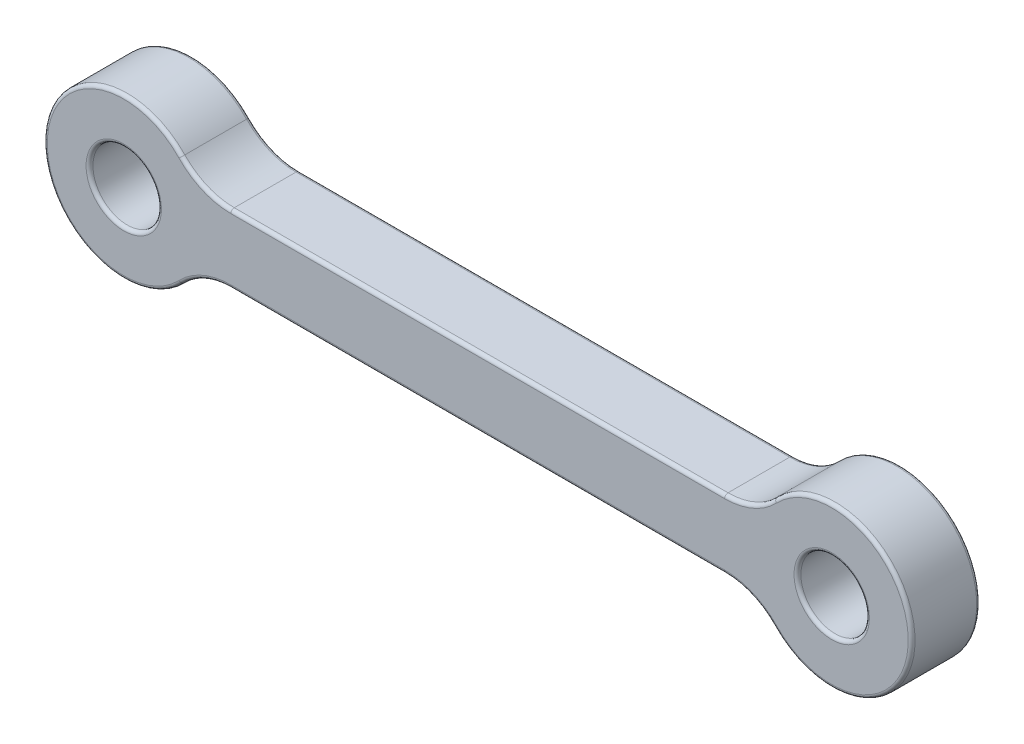
ISO-10303-21;
HEADER;
FILE_DESCRIPTION(('STEP AP214'),'2;1');
FILE_NAME('part.step','',(''),(''),'','','');
FILE_SCHEMA(('AUTOMOTIVE_DESIGN { 1 0 10303 214 1 1 1 1 }'));
ENDSEC;
DATA;
#1=APPLICATION_CONTEXT('core data for automotive mechanical design processes');
#2=APPLICATION_PROTOCOL_DEFINITION('international standard','automotive_design',2000,#1);
#3=PRODUCT_CONTEXT('',#1,'mechanical');
#4=PRODUCT('Part','Part','',(#3));
#5=PRODUCT_RELATED_PRODUCT_CATEGORY('part','',(#4));
#6=PRODUCT_DEFINITION_FORMATION('','',#4);
#7=PRODUCT_DEFINITION_CONTEXT('part definition',#1,'design');
#8=PRODUCT_DEFINITION('design','',#6,#7);
#9=PRODUCT_DEFINITION_SHAPE('','',#8);
#10=(LENGTH_UNIT() NAMED_UNIT(*) SI_UNIT(.MILLI.,.METRE.));
#11=(NAMED_UNIT(*) PLANE_ANGLE_UNIT() SI_UNIT($,.RADIAN.));
#12=(NAMED_UNIT(*) SI_UNIT($,.STERADIAN.) SOLID_ANGLE_UNIT());
#13=UNCERTAINTY_MEASURE_WITH_UNIT(LENGTH_MEASURE(1.E-05),#10,'distance_accuracy_value','');
#14=(GEOMETRIC_REPRESENTATION_CONTEXT(3) GLOBAL_UNCERTAINTY_ASSIGNED_CONTEXT((#13)) GLOBAL_UNIT_ASSIGNED_CONTEXT((#10,
#11,#12)) REPRESENTATION_CONTEXT('',''));
#15=CARTESIAN_POINT('',(0.,0.,0.));
#16=DIRECTION('',(0.,0.,1.));
#17=DIRECTION('',(1.,0.,0.));
#18=AXIS2_PLACEMENT_3D('',#15,#16,#17);
#19=CARTESIAN_POINT('',(0.,1.5,1.5));
#20=DIRECTION('',(0.,-1.,0.));
#21=DIRECTION('',(0.,0.,-1.));
#22=AXIS2_PLACEMENT_3D('',#19,#20,#21);
#23=PLANE('',#22);
#24=DIRECTION('',(0.,0.,-1.));
#25=VECTOR('',#24,1.);
#26=CARTESIAN_POINT('',(26.3095842401766,1.5,1.5));
#27=LINE('',#26,#25);
#28=CARTESIAN_POINT('',(26.3095842401766,1.5,1.35));
#29=VERTEX_POINT('',#28);
#30=CARTESIAN_POINT('',(26.3095842401766,1.5,-1.35));
#31=VERTEX_POINT('',#30);
#32=EDGE_CURVE('E303',#29,#31,#27,.T.);
#33=ORIENTED_EDGE('',*,*,#32,.T.);
#34=DIRECTION('',(-1.,0.,0.));
#35=VECTOR('',#34,1.);
#36=CARTESIAN_POINT('',(0.,1.5,-1.35));
#37=LINE('',#36,#35);
#38=CARTESIAN_POINT('',(4.69041575982343,1.5,-1.35));
#39=VERTEX_POINT('',#38);
#40=EDGE_CURVE('E225',#31,#39,#37,.T.);
#41=ORIENTED_EDGE('',*,*,#40,.T.);
#42=DIRECTION('',(0.,0.,1.));
#43=VECTOR('',#42,1.);
#44=CARTESIAN_POINT('',(4.69041575982343,1.5,1.5));
#45=LINE('',#44,#43);
#46=CARTESIAN_POINT('',(4.69041575982343,1.5,1.35));
#47=VERTEX_POINT('',#46);
#48=EDGE_CURVE('E297',#39,#47,#45,.T.);
#49=ORIENTED_EDGE('',*,*,#48,.T.);
#50=DIRECTION('',(-1.,0.,0.));
#51=VECTOR('',#50,1.);
#52=CARTESIAN_POINT('',(26.3095842401766,1.5,1.35));
#53=LINE('',#52,#51);
#54=EDGE_CURVE('E223',#47,#29,#53,.F.);
#55=ORIENTED_EDGE('',*,*,#54,.T.);
#56=EDGE_LOOP('',(#33,#41,#49,#55));
#57=FACE_BOUND('',#56,.T.);
#58=ADVANCED_FACE('F37',(#57),#23,.F.);
#59=CARTESIAN_POINT('',(0.,0.,1.5));
#60=DIRECTION('',(0.,0.,-1.));
#61=DIRECTION('',(-1.,0.,0.));
#62=AXIS2_PLACEMENT_3D('',#59,#60,#61);
#63=CYLINDRICAL_SURFACE('',#62,3.5);
#64=DIRECTION('',(0.,0.,-1.));
#65=VECTOR('',#64,1.);
#66=CARTESIAN_POINT('',(2.52560848605877,2.42307692307692,1.5));
#67=LINE('',#66,#65);
#68=CARTESIAN_POINT('',(2.52560848605877,2.42307692307692,1.35));
#69=VERTEX_POINT('',#68);
#70=CARTESIAN_POINT('',(2.52560848605877,2.42307692307692,-1.35));
#71=VERTEX_POINT('',#70);
#72=EDGE_CURVE('E299',#69,#71,#67,.T.);
#73=ORIENTED_EDGE('',*,*,#72,.T.);
#74=CARTESIAN_POINT('',(0.,0.,-1.35));
#75=DIRECTION('',(0.,0.,1.));
#76=DIRECTION('',(1.,0.,0.));
#77=AXIS2_PLACEMENT_3D('',#74,#75,#76);
#78=CIRCLE('',#77,3.5);
#79=CARTESIAN_POINT('',(2.52560848605877,-2.42307692307692,-1.35));
#80=VERTEX_POINT('',#79);
#81=EDGE_CURVE('E200',#71,#80,#78,.T.);
#82=ORIENTED_EDGE('',*,*,#81,.T.);
#83=DIRECTION('',(0.,0.,-1.));
#84=VECTOR('',#83,1.);
#85=CARTESIAN_POINT('',(2.52560848605877,-2.42307692307692,1.5));
#86=LINE('',#85,#84);
#87=CARTESIAN_POINT('',(2.52560848605877,-2.42307692307692,1.35));
#88=VERTEX_POINT('',#87);
#89=EDGE_CURVE('E304',#80,#88,#86,.F.);
#90=ORIENTED_EDGE('',*,*,#89,.T.);
#91=CARTESIAN_POINT('',(0.,0.,1.35));
#92=DIRECTION('',(0.,0.,1.));
#93=DIRECTION('',(1.,0.,0.));
#94=AXIS2_PLACEMENT_3D('',#91,#92,#93);
#95=CIRCLE('',#94,3.5);
#96=EDGE_CURVE('E198',#88,#69,#95,.F.);
#97=ORIENTED_EDGE('',*,*,#96,.T.);
#98=EDGE_LOOP('',(#73,#82,#90,#97));
#99=FACE_BOUND('',#98,.T.);
#100=ADVANCED_FACE('F334',(#99),#63,.T.);
#101=CARTESIAN_POINT('',(0.,-1.5,1.5));
#102=DIRECTION('',(0.,-1.,0.));
#103=DIRECTION('',(0.,0.,-1.));
#104=AXIS2_PLACEMENT_3D('',#101,#102,#103);
#105=PLANE('',#104);
#106=DIRECTION('',(0.,0.,-1.));
#107=VECTOR('',#106,1.);
#108=CARTESIAN_POINT('',(4.69041575982343,-1.5,1.5));
#109=LINE('',#108,#107);
#110=CARTESIAN_POINT('',(4.69041575982343,-1.5,1.35));
#111=VERTEX_POINT('',#110);
#112=CARTESIAN_POINT('',(4.69041575982343,-1.5,-1.35));
#113=VERTEX_POINT('',#112);
#114=EDGE_CURVE('E337',#111,#113,#109,.T.);
#115=ORIENTED_EDGE('',*,*,#114,.T.);
#116=DIRECTION('',(-1.,0.,0.));
#117=VECTOR('',#116,1.);
#118=CARTESIAN_POINT('',(26.3095842401766,-1.5,-1.35));
#119=LINE('',#118,#117);
#120=CARTESIAN_POINT('',(26.3095842401766,-1.5,-1.35));
#121=VERTEX_POINT('',#120);
#122=EDGE_CURVE('E208',#113,#121,#119,.F.);
#123=ORIENTED_EDGE('',*,*,#122,.T.);
#124=DIRECTION('',(0.,0.,1.));
#125=VECTOR('',#124,1.);
#126=CARTESIAN_POINT('',(26.3095842401766,-1.5,1.5));
#127=LINE('',#126,#125);
#128=CARTESIAN_POINT('',(26.3095842401766,-1.5,1.35));
#129=VERTEX_POINT('',#128);
#130=EDGE_CURVE('E335',#121,#129,#127,.T.);
#131=ORIENTED_EDGE('',*,*,#130,.T.);
#132=DIRECTION('',(-1.,0.,0.));
#133=VECTOR('',#132,1.);
#134=CARTESIAN_POINT('',(0.,-1.5,1.35));
#135=LINE('',#134,#133);
#136=EDGE_CURVE('E206',#129,#111,#135,.T.);
#137=ORIENTED_EDGE('',*,*,#136,.T.);
#138=EDGE_LOOP('',(#115,#123,#131,#137));
#139=FACE_BOUND('',#138,.T.);
#140=ADVANCED_FACE('F373',(#139),#105,.T.);
#141=CARTESIAN_POINT('',(0.,0.,1.5));
#142=DIRECTION('',(0.,0.,-1.));
#143=DIRECTION('',(-1.,0.,0.));
#144=AXIS2_PLACEMENT_3D('',#141,#142,#143);
#145=CYLINDRICAL_SURFACE('',#144,1.5);
#146=CARTESIAN_POINT('',(0.,0.,-1.35));
#147=DIRECTION('',(0.,0.,1.));
#148=DIRECTION('',(1.,0.,0.));
#149=AXIS2_PLACEMENT_3D('',#146,#147,#148);
#150=CIRCLE('',#149,1.5);
#151=CARTESIAN_POINT('',(1.5,0.,-1.35));
#152=VERTEX_POINT('',#151);
#153=EDGE_CURVE('E192',#152,#152,#150,.F.);
#154=ORIENTED_EDGE('',*,*,#153,.T.);
#155=EDGE_LOOP('',(#154));
#156=FACE_BOUND('',#155,.T.);
#157=CARTESIAN_POINT('',(0.,0.,1.35));
#158=DIRECTION('',(0.,0.,1.));
#159=DIRECTION('',(1.,0.,0.));
#160=AXIS2_PLACEMENT_3D('',#157,#158,#159);
#161=CIRCLE('',#160,1.5);
#162=CARTESIAN_POINT('',(1.5,0.,1.35));
#163=VERTEX_POINT('',#162);
#164=EDGE_CURVE('E189',#163,#163,#161,.T.);
#165=ORIENTED_EDGE('',*,*,#164,.T.);
#166=EDGE_LOOP('',(#165));
#167=FACE_BOUND('',#166,.T.);
#168=ADVANCED_FACE('F640',(#156,#167),#145,.F.);
#169=CARTESIAN_POINT('',(31.,0.,1.5));
#170=DIRECTION('',(0.,0.,-1.));
#171=DIRECTION('',(-1.,0.,0.));
#172=AXIS2_PLACEMENT_3D('',#169,#170,#171);
#173=CYLINDRICAL_SURFACE('',#172,3.5);
#174=DIRECTION('',(0.,0.,-1.));
#175=VECTOR('',#174,1.);
#176=CARTESIAN_POINT('',(28.4743915139412,-2.42307692307692,1.5));
#177=LINE('',#176,#175);
#178=CARTESIAN_POINT('',(28.4743915139412,-2.42307692307692,1.35));
#179=VERTEX_POINT('',#178);
#180=CARTESIAN_POINT('',(28.4743915139412,-2.42307692307692,-1.35));
#181=VERTEX_POINT('',#180);
#182=EDGE_CURVE('E342',#179,#181,#177,.T.);
#183=ORIENTED_EDGE('',*,*,#182,.T.);
#184=CARTESIAN_POINT('',(31.,0.,-1.35));
#185=DIRECTION('',(0.,0.,1.));
#186=DIRECTION('',(1.,0.,0.));
#187=AXIS2_PLACEMENT_3D('',#184,#185,#186);
#188=CIRCLE('',#187,3.5);
#189=CARTESIAN_POINT('',(28.4743915139412,2.42307692307692,-1.35));
#190=VERTEX_POINT('',#189);
#191=EDGE_CURVE('E217',#181,#190,#188,.T.);
#192=ORIENTED_EDGE('',*,*,#191,.T.);
#193=DIRECTION('',(0.,0.,-1.));
#194=VECTOR('',#193,1.);
#195=CARTESIAN_POINT('',(28.4743915139412,2.42307692307692,1.5));
#196=LINE('',#195,#194);
#197=CARTESIAN_POINT('',(28.4743915139412,2.42307692307692,1.35));
#198=VERTEX_POINT('',#197);
#199=EDGE_CURVE('E260',#190,#198,#196,.F.);
#200=ORIENTED_EDGE('',*,*,#199,.T.);
#201=CARTESIAN_POINT('',(31.,0.,1.35));
#202=DIRECTION('',(0.,0.,1.));
#203=DIRECTION('',(1.,0.,0.));
#204=AXIS2_PLACEMENT_3D('',#201,#202,#203);
#205=CIRCLE('',#204,3.5);
#206=EDGE_CURVE('E215',#198,#179,#205,.F.);
#207=ORIENTED_EDGE('',*,*,#206,.T.);
#208=EDGE_LOOP('',(#183,#192,#200,#207));
#209=FACE_BOUND('',#208,.T.);
#210=ADVANCED_FACE('F349',(#209),#173,.T.);
#211=CARTESIAN_POINT('',(31.,0.,1.5));
#212=DIRECTION('',(0.,0.,-1.));
#213=DIRECTION('',(-1.,0.,0.));
#214=AXIS2_PLACEMENT_3D('',#211,#212,#213);
#215=CYLINDRICAL_SURFACE('',#214,1.5);
#216=CARTESIAN_POINT('',(31.,0.,-1.35));
#217=DIRECTION('',(0.,0.,1.));
#218=DIRECTION('',(1.,0.,0.));
#219=AXIS2_PLACEMENT_3D('',#216,#217,#218);
#220=CIRCLE('',#219,1.5);
#221=CARTESIAN_POINT('',(32.5,0.,-1.35));
#222=VERTEX_POINT('',#221);
#223=EDGE_CURVE('E172',#222,#222,#220,.F.);
#224=ORIENTED_EDGE('',*,*,#223,.T.);
#225=EDGE_LOOP('',(#224));
#226=FACE_BOUND('',#225,.T.);
#227=CARTESIAN_POINT('',(31.,0.,1.35));
#228=DIRECTION('',(0.,0.,1.));
#229=DIRECTION('',(1.,0.,0.));
#230=AXIS2_PLACEMENT_3D('',#227,#228,#229);
#231=CIRCLE('',#230,1.5);
#232=CARTESIAN_POINT('',(32.5,0.,1.35));
#233=VERTEX_POINT('',#232);
#234=EDGE_CURVE('E306',#233,#233,#231,.T.);
#235=ORIENTED_EDGE('',*,*,#234,.T.);
#236=EDGE_LOOP('',(#235));
#237=FACE_BOUND('',#236,.T.);
#238=ADVANCED_FACE('F618',(#226,#237),#215,.F.);
#239=CARTESIAN_POINT('',(0.,0.,1.5));
#240=DIRECTION('',(0.,0.,1.));
#241=DIRECTION('',(1.,0.,0.));
#242=AXIS2_PLACEMENT_3D('',#239,#240,#241);
#243=PLANE('',#242);
#244=CARTESIAN_POINT('',(31.,0.,1.5));
#245=DIRECTION('',(0.,0.,1.));
#246=DIRECTION('',(1.,0.,0.));
#247=AXIS2_PLACEMENT_3D('',#244,#245,#246);
#248=CIRCLE('',#247,1.65);
#249=CARTESIAN_POINT('',(32.65,0.,1.5));
#250=VERTEX_POINT('',#249);
#251=EDGE_CURVE('E11',#250,#250,#248,.F.);
#252=ORIENTED_EDGE('',*,*,#251,.T.);
#253=EDGE_LOOP('',(#252));
#254=FACE_BOUND('',#253,.T.);
#255=CARTESIAN_POINT('',(0.,0.,1.5));
#256=DIRECTION('',(0.,0.,1.));
#257=DIRECTION('',(1.,0.,0.));
#258=AXIS2_PLACEMENT_3D('',#255,#256,#257);
#259=CIRCLE('',#258,1.65);
#260=CARTESIAN_POINT('',(1.65,0.,1.5));
#261=VERTEX_POINT('',#260);
#262=EDGE_CURVE('E46',#261,#261,#259,.F.);
#263=ORIENTED_EDGE('',*,*,#262,.T.);
#264=EDGE_LOOP('',(#263));
#265=FACE_BOUND('',#264,.T.);
#266=DIRECTION('',(-1.,0.,0.));
#267=VECTOR('',#266,1.);
#268=CARTESIAN_POINT('',(0.,-1.35,1.5));
#269=LINE('',#268,#267);
#270=CARTESIAN_POINT('',(4.69041575982343,-1.35,1.5));
#271=VERTEX_POINT('',#270);
#272=CARTESIAN_POINT('',(26.3095842401766,-1.35,1.5));
#273=VERTEX_POINT('',#272);
#274=EDGE_CURVE('E54',#271,#273,#269,.F.);
#275=ORIENTED_EDGE('',*,*,#274,.T.);
#276=CARTESIAN_POINT('',(26.3095842401766,-4.5,1.5));
#277=DIRECTION('',(0.,0.,1.));
#278=DIRECTION('',(1.,0.,0.));
#279=AXIS2_PLACEMENT_3D('',#276,#277,#278);
#280=CIRCLE('',#279,3.15);
#281=CARTESIAN_POINT('',(28.5826318776295,-2.31923076923077,1.5));
#282=VERTEX_POINT('',#281);
#283=EDGE_CURVE('E239',#273,#282,#280,.F.);
#284=ORIENTED_EDGE('',*,*,#283,.T.);
#285=CARTESIAN_POINT('',(31.,0.,1.5));
#286=DIRECTION('',(0.,0.,1.));
#287=DIRECTION('',(1.,0.,0.));
#288=AXIS2_PLACEMENT_3D('',#285,#286,#287);
#289=CIRCLE('',#288,3.35);
#290=CARTESIAN_POINT('',(28.5826318776295,2.31923076923077,1.5));
#291=VERTEX_POINT('',#290);
#292=EDGE_CURVE('E227',#282,#291,#289,.T.);
#293=ORIENTED_EDGE('',*,*,#292,.T.);
#294=CARTESIAN_POINT('',(26.3095842401766,4.5,1.5));
#295=DIRECTION('',(0.,0.,1.));
#296=DIRECTION('',(1.,0.,0.));
#297=AXIS2_PLACEMENT_3D('',#294,#295,#296);
#298=CIRCLE('',#297,3.15);
#299=CARTESIAN_POINT('',(26.3095842401766,1.35,1.5));
#300=VERTEX_POINT('',#299);
#301=EDGE_CURVE('E229',#291,#300,#298,.F.);
#302=ORIENTED_EDGE('',*,*,#301,.T.);
#303=DIRECTION('',(-1.,0.,0.));
#304=VECTOR('',#303,1.);
#305=CARTESIAN_POINT('',(4.69041575982343,1.35,1.5));
#306=LINE('',#305,#304);
#307=CARTESIAN_POINT('',(4.69041575982343,1.35,1.5));
#308=VERTEX_POINT('',#307);
#309=EDGE_CURVE('E231',#300,#308,#306,.T.);
#310=ORIENTED_EDGE('',*,*,#309,.T.);
#311=CARTESIAN_POINT('',(4.69041575982343,4.5,1.5));
#312=DIRECTION('',(0.,0.,1.));
#313=DIRECTION('',(1.,0.,0.));
#314=AXIS2_PLACEMENT_3D('',#311,#312,#313);
#315=CIRCLE('',#314,3.15);
#316=CARTESIAN_POINT('',(2.41736812237054,2.31923076923077,1.5));
#317=VERTEX_POINT('',#316);
#318=EDGE_CURVE('E233',#308,#317,#315,.F.);
#319=ORIENTED_EDGE('',*,*,#318,.T.);
#320=CARTESIAN_POINT('',(0.,0.,1.5));
#321=DIRECTION('',(0.,0.,1.));
#322=DIRECTION('',(1.,0.,0.));
#323=AXIS2_PLACEMENT_3D('',#320,#321,#322);
#324=CIRCLE('',#323,3.35);
#325=CARTESIAN_POINT('',(2.41736812237054,-2.31923076923077,1.5));
#326=VERTEX_POINT('',#325);
#327=EDGE_CURVE('E235',#317,#326,#324,.T.);
#328=ORIENTED_EDGE('',*,*,#327,.T.);
#329=CARTESIAN_POINT('',(4.69041575982343,-4.5,1.5));
#330=DIRECTION('',(0.,0.,1.));
#331=DIRECTION('',(1.,0.,0.));
#332=AXIS2_PLACEMENT_3D('',#329,#330,#331);
#333=CIRCLE('',#332,3.15);
#334=EDGE_CURVE('E59',#326,#271,#333,.F.);
#335=ORIENTED_EDGE('',*,*,#334,.T.);
#336=EDGE_LOOP('',(#275,#284,#293,#302,#310,#319,#328,#335));
#337=FACE_BOUND('',#336,.T.);
#338=ADVANCED_FACE('F392',(#254,#265,#337),#243,.T.);
#339=CARTESIAN_POINT('',(0.,0.,-1.5));
#340=DIRECTION('',(0.,0.,1.));
#341=DIRECTION('',(1.,0.,0.));
#342=AXIS2_PLACEMENT_3D('',#339,#340,#341);
#343=PLANE('',#342);
#344=CARTESIAN_POINT('',(31.,0.,-1.5));
#345=DIRECTION('',(0.,0.,1.));
#346=DIRECTION('',(1.,0.,0.));
#347=AXIS2_PLACEMENT_3D('',#344,#345,#346);
#348=CIRCLE('',#347,1.65);
#349=CARTESIAN_POINT('',(32.65,0.,-1.5));
#350=VERTEX_POINT('',#349);
#351=EDGE_CURVE('E181',#350,#350,#348,.T.);
#352=ORIENTED_EDGE('',*,*,#351,.T.);
#353=EDGE_LOOP('',(#352));
#354=FACE_BOUND('',#353,.T.);
#355=CARTESIAN_POINT('',(0.,0.,-1.5));
#356=DIRECTION('',(0.,0.,1.));
#357=DIRECTION('',(1.,0.,0.));
#358=AXIS2_PLACEMENT_3D('',#355,#356,#357);
#359=CIRCLE('',#358,1.65);
#360=CARTESIAN_POINT('',(1.65,0.,-1.5));
#361=VERTEX_POINT('',#360);
#362=EDGE_CURVE('E178',#361,#361,#359,.T.);
#363=ORIENTED_EDGE('',*,*,#362,.T.);
#364=EDGE_LOOP('',(#363));
#365=FACE_BOUND('',#364,.T.);
#366=CARTESIAN_POINT('',(0.,0.,-1.5));
#367=DIRECTION('',(0.,0.,1.));
#368=DIRECTION('',(1.,0.,0.));
#369=AXIS2_PLACEMENT_3D('',#366,#367,#368);
#370=CIRCLE('',#369,3.35);
#371=CARTESIAN_POINT('',(2.41736812237054,-2.31923076923077,-1.5));
#372=VERTEX_POINT('',#371);
#373=CARTESIAN_POINT('',(2.41736812237054,2.31923076923077,-1.5));
#374=VERTEX_POINT('',#373);
#375=EDGE_CURVE('E176',#372,#374,#370,.F.);
#376=ORIENTED_EDGE('',*,*,#375,.T.);
#377=CARTESIAN_POINT('',(4.69041575982343,4.5,-1.5));
#378=DIRECTION('',(0.,0.,1.));
#379=DIRECTION('',(1.,0.,0.));
#380=AXIS2_PLACEMENT_3D('',#377,#378,#379);
#381=CIRCLE('',#380,3.15);
#382=CARTESIAN_POINT('',(4.69041575982343,1.35,-1.5));
#383=VERTEX_POINT('',#382);
#384=EDGE_CURVE('E157',#374,#383,#381,.T.);
#385=ORIENTED_EDGE('',*,*,#384,.T.);
#386=DIRECTION('',(-1.,0.,0.));
#387=VECTOR('',#386,1.);
#388=CARTESIAN_POINT('',(0.,1.35,-1.5));
#389=LINE('',#388,#387);
#390=CARTESIAN_POINT('',(26.3095842401766,1.35,-1.5));
#391=VERTEX_POINT('',#390);
#392=EDGE_CURVE('E165',#383,#391,#389,.F.);
#393=ORIENTED_EDGE('',*,*,#392,.T.);
#394=CARTESIAN_POINT('',(26.3095842401766,4.5,-1.5));
#395=DIRECTION('',(0.,0.,1.));
#396=DIRECTION('',(1.,0.,0.));
#397=AXIS2_PLACEMENT_3D('',#394,#395,#396);
#398=CIRCLE('',#397,3.15);
#399=CARTESIAN_POINT('',(28.5826318776295,2.31923076923077,-1.5));
#400=VERTEX_POINT('',#399);
#401=EDGE_CURVE('E171',#391,#400,#398,.T.);
#402=ORIENTED_EDGE('',*,*,#401,.T.);
#403=CARTESIAN_POINT('',(31.,0.,-1.5));
#404=DIRECTION('',(0.,0.,1.));
#405=DIRECTION('',(1.,0.,0.));
#406=AXIS2_PLACEMENT_3D('',#403,#404,#405);
#407=CIRCLE('',#406,3.35);
#408=CARTESIAN_POINT('',(28.5826318776295,-2.31923076923077,-1.5));
#409=VERTEX_POINT('',#408);
#410=EDGE_CURVE('E317',#400,#409,#407,.F.);
#411=ORIENTED_EDGE('',*,*,#410,.T.);
#412=CARTESIAN_POINT('',(26.3095842401766,-4.5,-1.5));
#413=DIRECTION('',(0.,0.,1.));
#414=DIRECTION('',(1.,0.,0.));
#415=AXIS2_PLACEMENT_3D('',#412,#413,#414);
#416=CIRCLE('',#415,3.15);
#417=CARTESIAN_POINT('',(26.3095842401766,-1.35,-1.5));
#418=VERTEX_POINT('',#417);
#419=EDGE_CURVE('E319',#409,#418,#416,.T.);
#420=ORIENTED_EDGE('',*,*,#419,.T.);
#421=DIRECTION('',(-1.,0.,0.));
#422=VECTOR('',#421,1.);
#423=CARTESIAN_POINT('',(4.69041575982343,-1.35,-1.5));
#424=LINE('',#423,#422);
#425=CARTESIAN_POINT('',(4.69041575982343,-1.35,-1.5));
#426=VERTEX_POINT('',#425);
#427=EDGE_CURVE('E321',#418,#426,#424,.T.);
#428=ORIENTED_EDGE('',*,*,#427,.T.);
#429=CARTESIAN_POINT('',(4.69041575982343,-4.5,-1.5));
#430=DIRECTION('',(0.,0.,1.));
#431=DIRECTION('',(1.,0.,0.));
#432=AXIS2_PLACEMENT_3D('',#429,#430,#431);
#433=CIRCLE('',#432,3.15);
#434=EDGE_CURVE('E183',#426,#372,#433,.T.);
#435=ORIENTED_EDGE('',*,*,#434,.T.);
#436=EDGE_LOOP('',(#376,#385,#393,#402,#411,#420,#428,#435));
#437=FACE_BOUND('',#436,.T.);
#438=ADVANCED_FACE('F174',(#354,#365,#437),#343,.F.);
#439=CARTESIAN_POINT('',(26.3095842401766,-4.5,1.5));
#440=DIRECTION('',(0.,0.,-1.));
#441=DIRECTION('',(-1.,0.,0.));
#442=AXIS2_PLACEMENT_3D('',#439,#440,#441);
#443=CYLINDRICAL_SURFACE('',#442,3.);
#444=ORIENTED_EDGE('',*,*,#130,.F.);
#445=CARTESIAN_POINT('',(26.3095842401766,-4.5,-1.35));
#446=DIRECTION('',(0.,0.,1.));
#447=DIRECTION('',(1.,0.,0.));
#448=AXIS2_PLACEMENT_3D('',#445,#446,#447);
#449=CIRCLE('',#448,3.);
#450=EDGE_CURVE('E213',#121,#181,#449,.F.);
#451=ORIENTED_EDGE('',*,*,#450,.T.);
#452=ORIENTED_EDGE('',*,*,#182,.F.);
#453=CARTESIAN_POINT('',(26.3095842401766,-4.5,1.35));
#454=DIRECTION('',(0.,0.,1.));
#455=DIRECTION('',(1.,0.,0.));
#456=AXIS2_PLACEMENT_3D('',#453,#454,#455);
#457=CIRCLE('',#456,3.);
#458=EDGE_CURVE('E210',#179,#129,#457,.T.);
#459=ORIENTED_EDGE('',*,*,#458,.T.);
#460=EDGE_LOOP('',(#444,#451,#452,#459));
#461=FACE_BOUND('',#460,.T.);
#462=ADVANCED_FACE('F370',(#461),#443,.F.);
#463=CARTESIAN_POINT('',(4.69041575982343,-4.5,1.5));
#464=DIRECTION('',(0.,0.,-1.));
#465=DIRECTION('',(-1.,0.,0.));
#466=AXIS2_PLACEMENT_3D('',#463,#464,#465);
#467=CYLINDRICAL_SURFACE('',#466,3.);
#468=ORIENTED_EDGE('',*,*,#89,.F.);
#469=CARTESIAN_POINT('',(4.69041575982343,-4.5,-1.35));
#470=DIRECTION('',(0.,0.,1.));
#471=DIRECTION('',(1.,0.,0.));
#472=AXIS2_PLACEMENT_3D('',#469,#470,#471);
#473=CIRCLE('',#472,3.);
#474=EDGE_CURVE('E204',#80,#113,#473,.F.);
#475=ORIENTED_EDGE('',*,*,#474,.T.);
#476=ORIENTED_EDGE('',*,*,#114,.F.);
#477=CARTESIAN_POINT('',(4.69041575982343,-4.5,1.35));
#478=DIRECTION('',(0.,0.,1.));
#479=DIRECTION('',(1.,0.,0.));
#480=AXIS2_PLACEMENT_3D('',#477,#478,#479);
#481=CIRCLE('',#480,3.);
#482=EDGE_CURVE('E202',#111,#88,#481,.T.);
#483=ORIENTED_EDGE('',*,*,#482,.T.);
#484=EDGE_LOOP('',(#468,#475,#476,#483));
#485=FACE_BOUND('',#484,.T.);
#486=ADVANCED_FACE('F416',(#485),#467,.F.);
#487=CARTESIAN_POINT('',(26.3095842401766,4.5,1.5));
#488=DIRECTION('',(0.,0.,-1.));
#489=DIRECTION('',(-1.,0.,0.));
#490=AXIS2_PLACEMENT_3D('',#487,#488,#489);
#491=CYLINDRICAL_SURFACE('',#490,3.);
#492=ORIENTED_EDGE('',*,*,#199,.F.);
#493=CARTESIAN_POINT('',(26.3095842401766,4.5,-1.35));
#494=DIRECTION('',(0.,0.,1.));
#495=DIRECTION('',(1.,0.,0.));
#496=AXIS2_PLACEMENT_3D('',#493,#494,#495);
#497=CIRCLE('',#496,3.);
#498=EDGE_CURVE('E221',#190,#31,#497,.F.);
#499=ORIENTED_EDGE('',*,*,#498,.T.);
#500=ORIENTED_EDGE('',*,*,#32,.F.);
#501=CARTESIAN_POINT('',(26.3095842401766,4.5,1.35));
#502=DIRECTION('',(0.,0.,1.));
#503=DIRECTION('',(1.,0.,0.));
#504=AXIS2_PLACEMENT_3D('',#501,#502,#503);
#505=CIRCLE('',#504,3.);
#506=EDGE_CURVE('E219',#29,#198,#505,.T.);
#507=ORIENTED_EDGE('',*,*,#506,.T.);
#508=EDGE_LOOP('',(#492,#499,#500,#507));
#509=FACE_BOUND('',#508,.T.);
#510=ADVANCED_FACE('F389',(#509),#491,.F.);
#511=CARTESIAN_POINT('',(4.69041575982343,4.5,1.5));
#512=DIRECTION('',(0.,0.,-1.));
#513=DIRECTION('',(-1.,0.,0.));
#514=AXIS2_PLACEMENT_3D('',#511,#512,#513);
#515=CYLINDRICAL_SURFACE('',#514,3.);
#516=ORIENTED_EDGE('',*,*,#48,.F.);
#517=CARTESIAN_POINT('',(4.69041575982343,4.5,-1.35));
#518=DIRECTION('',(0.,0.,1.));
#519=DIRECTION('',(1.,0.,0.));
#520=AXIS2_PLACEMENT_3D('',#517,#518,#519);
#521=CIRCLE('',#520,3.);
#522=EDGE_CURVE('E159',#39,#71,#521,.F.);
#523=ORIENTED_EDGE('',*,*,#522,.T.);
#524=ORIENTED_EDGE('',*,*,#72,.F.);
#525=CARTESIAN_POINT('',(4.69041575982343,4.5,1.35));
#526=DIRECTION('',(0.,0.,1.));
#527=DIRECTION('',(1.,0.,0.));
#528=AXIS2_PLACEMENT_3D('',#525,#526,#527);
#529=CIRCLE('',#528,3.);
#530=EDGE_CURVE('E195',#69,#47,#529,.T.);
#531=ORIENTED_EDGE('',*,*,#530,.T.);
#532=EDGE_LOOP('',(#516,#523,#524,#531));
#533=FACE_BOUND('',#532,.T.);
#534=ADVANCED_FACE('F296',(#533),#515,.F.);
#535=CARTESIAN_POINT('',(31.,0.,-1.35));
#536=DIRECTION('',(0.,0.,1.));
#537=DIRECTION('',(1.,0.,0.));
#538=AXIS2_PLACEMENT_3D('',#535,#536,#537);
#539=TOROIDAL_SURFACE('',#538,1.65,0.15);
#540=ORIENTED_EDGE('',*,*,#351,.F.);
#541=EDGE_LOOP('',(#540));
#542=FACE_BOUND('',#541,.T.);
#543=ORIENTED_EDGE('',*,*,#223,.F.);
#544=EDGE_LOOP('',(#543));
#545=FACE_BOUND('',#544,.T.);
#546=ADVANCED_FACE('F424',(#542,#545),#539,.T.);
#547=CARTESIAN_POINT('',(0.,0.,-1.35));
#548=DIRECTION('',(0.,0.,1.));
#549=DIRECTION('',(1.,0.,0.));
#550=AXIS2_PLACEMENT_3D('',#547,#548,#549);
#551=TOROIDAL_SURFACE('',#550,1.65,0.15);
#552=ORIENTED_EDGE('',*,*,#153,.F.);
#553=EDGE_LOOP('',(#552));
#554=FACE_BOUND('',#553,.T.);
#555=ORIENTED_EDGE('',*,*,#362,.F.);
#556=EDGE_LOOP('',(#555));
#557=FACE_BOUND('',#556,.T.);
#558=ADVANCED_FACE('F427',(#554,#557),#551,.T.);
#559=CARTESIAN_POINT('',(26.3095842401766,-4.5,-1.35));
#560=DIRECTION('',(0.,0.,1.));
#561=DIRECTION('',(1.,0.,0.));
#562=AXIS2_PLACEMENT_3D('',#559,#560,#561);
#563=TOROIDAL_SURFACE('',#562,3.15,0.15);
#564=CARTESIAN_POINT('',(28.5826318776295,-2.31923076923077,-1.35));
#565=DIRECTION('',(0.692307692307697,-0.721602424588216,0.));
#566=DIRECTION('',(0.721602424588216,0.692307692307697,0.));
#567=AXIS2_PLACEMENT_3D('',#564,#565,#566);
#568=CIRCLE('',#567,0.15);
#569=EDGE_CURVE('E254',#181,#409,#568,.T.);
#570=ORIENTED_EDGE('',*,*,#569,.F.);
#571=ORIENTED_EDGE('',*,*,#450,.F.);
#572=CARTESIAN_POINT('',(26.3095842401766,-1.35,-1.35));
#573=DIRECTION('',(-1.,0.,0.));
#574=DIRECTION('',(0.,0.,1.));
#575=AXIS2_PLACEMENT_3D('',#572,#573,#574);
#576=CIRCLE('',#575,0.15);
#577=EDGE_CURVE('E257',#418,#121,#576,.T.);
#578=ORIENTED_EDGE('',*,*,#577,.F.);
#579=ORIENTED_EDGE('',*,*,#419,.F.);
#580=EDGE_LOOP('',(#570,#571,#578,#579));
#581=FACE_BOUND('',#580,.T.);
#582=ADVANCED_FACE('F382',(#581),#563,.T.);
#583=CARTESIAN_POINT('',(0.,-1.35,-1.35));
#584=DIRECTION('',(1.,0.,0.));
#585=DIRECTION('',(0.,0.,-1.));
#586=AXIS2_PLACEMENT_3D('',#583,#584,#585);
#587=CYLINDRICAL_SURFACE('',#586,0.15);
#588=ORIENTED_EDGE('',*,*,#577,.T.);
#589=ORIENTED_EDGE('',*,*,#122,.F.);
#590=CARTESIAN_POINT('',(4.69041575982343,-1.35,-1.35));
#591=DIRECTION('',(-1.,0.,0.));
#592=DIRECTION('',(0.,0.,1.));
#593=AXIS2_PLACEMENT_3D('',#590,#591,#592);
#594=CIRCLE('',#593,0.15);
#595=EDGE_CURVE('E251',#426,#113,#594,.T.);
#596=ORIENTED_EDGE('',*,*,#595,.F.);
#597=ORIENTED_EDGE('',*,*,#427,.F.);
#598=EDGE_LOOP('',(#588,#589,#596,#597));
#599=FACE_BOUND('',#598,.T.);
#600=ADVANCED_FACE('F377',(#599),#587,.T.);
#601=CARTESIAN_POINT('',(31.,0.,-1.35));
#602=DIRECTION('',(0.,0.,1.));
#603=DIRECTION('',(1.,0.,0.));
#604=AXIS2_PLACEMENT_3D('',#601,#602,#603);
#605=TOROIDAL_SURFACE('',#604,3.35,0.15);
#606=ORIENTED_EDGE('',*,*,#569,.T.);
#607=ORIENTED_EDGE('',*,*,#410,.F.);
#608=CARTESIAN_POINT('',(28.5826318776295,2.31923076923077,-1.35));
#609=DIRECTION('',(-0.692307692307698,-0.721602424588214,0.));
#610=DIRECTION('',(0.721602424588214,-0.692307692307698,0.));
#611=AXIS2_PLACEMENT_3D('',#608,#609,#610);
#612=CIRCLE('',#611,0.15);
#613=EDGE_CURVE('E248',#190,#400,#612,.T.);
#614=ORIENTED_EDGE('',*,*,#613,.F.);
#615=ORIENTED_EDGE('',*,*,#191,.F.);
#616=EDGE_LOOP('',(#606,#607,#614,#615));
#617=FACE_BOUND('',#616,.T.);
#618=ADVANCED_FACE('F385',(#617),#605,.T.);
#619=CARTESIAN_POINT('',(4.69041575982343,-4.5,-1.35));
#620=DIRECTION('',(0.,0.,1.));
#621=DIRECTION('',(1.,0.,0.));
#622=AXIS2_PLACEMENT_3D('',#619,#620,#621);
#623=TOROIDAL_SURFACE('',#622,3.15,0.15);
#624=ORIENTED_EDGE('',*,*,#595,.T.);
#625=ORIENTED_EDGE('',*,*,#474,.F.);
#626=CARTESIAN_POINT('',(2.41736812237054,-2.31923076923077,-1.35));
#627=DIRECTION('',(-0.692307692307693,-0.72160242458822,0.));
#628=DIRECTION('',(0.72160242458822,-0.692307692307693,0.));
#629=AXIS2_PLACEMENT_3D('',#626,#627,#628);
#630=CIRCLE('',#629,0.15);
#631=EDGE_CURVE('E245',#372,#80,#630,.T.);
#632=ORIENTED_EDGE('',*,*,#631,.F.);
#633=ORIENTED_EDGE('',*,*,#434,.F.);
#634=EDGE_LOOP('',(#624,#625,#632,#633));
#635=FACE_BOUND('',#634,.T.);
#636=ADVANCED_FACE('F328',(#635),#623,.T.);
#637=CARTESIAN_POINT('',(26.3095842401766,4.5,-1.35));
#638=DIRECTION('',(0.,0.,1.));
#639=DIRECTION('',(1.,0.,0.));
#640=AXIS2_PLACEMENT_3D('',#637,#638,#639);
#641=TOROIDAL_SURFACE('',#640,3.15,0.15);
#642=ORIENTED_EDGE('',*,*,#613,.T.);
#643=ORIENTED_EDGE('',*,*,#401,.F.);
#644=CARTESIAN_POINT('',(26.3095842401766,1.35,-1.35));
#645=DIRECTION('',(-1.,0.,0.));
#646=DIRECTION('',(0.,0.,1.));
#647=AXIS2_PLACEMENT_3D('',#644,#645,#646);
#648=CIRCLE('',#647,0.15);
#649=EDGE_CURVE('E168',#31,#391,#648,.T.);
#650=ORIENTED_EDGE('',*,*,#649,.F.);
#651=ORIENTED_EDGE('',*,*,#498,.F.);
#652=EDGE_LOOP('',(#642,#643,#650,#651));
#653=FACE_BOUND('',#652,.T.);
#654=ADVANCED_FACE('F388',(#653),#641,.T.);
#655=CARTESIAN_POINT('',(0.,0.,-1.35));
#656=DIRECTION('',(0.,0.,1.));
#657=DIRECTION('',(1.,0.,0.));
#658=AXIS2_PLACEMENT_3D('',#655,#656,#657);
#659=TOROIDAL_SURFACE('',#658,3.35,0.15);
#660=ORIENTED_EDGE('',*,*,#631,.T.);
#661=ORIENTED_EDGE('',*,*,#81,.F.);
#662=CARTESIAN_POINT('',(2.41736812237054,2.31923076923077,-1.35));
#663=DIRECTION('',(0.692307692307693,-0.72160242458822,0.));
#664=DIRECTION('',(0.72160242458822,0.692307692307693,0.));
#665=AXIS2_PLACEMENT_3D('',#662,#663,#664);
#666=CIRCLE('',#665,0.15);
#667=EDGE_CURVE('E162',#374,#71,#666,.T.);
#668=ORIENTED_EDGE('',*,*,#667,.F.);
#669=ORIENTED_EDGE('',*,*,#375,.F.);
#670=EDGE_LOOP('',(#660,#661,#668,#669));
#671=FACE_BOUND('',#670,.T.);
#672=ADVANCED_FACE('F331',(#671),#659,.T.);
#673=CARTESIAN_POINT('',(0.,1.35,-1.35));
#674=DIRECTION('',(-1.,0.,0.));
#675=DIRECTION('',(0.,0.,1.));
#676=AXIS2_PLACEMENT_3D('',#673,#674,#675);
#677=CYLINDRICAL_SURFACE('',#676,0.15);
#678=ORIENTED_EDGE('',*,*,#649,.T.);
#679=ORIENTED_EDGE('',*,*,#392,.F.);
#680=CARTESIAN_POINT('',(4.69041575982343,1.35,-1.35));
#681=DIRECTION('',(-1.,0.,0.));
#682=DIRECTION('',(0.,0.,1.));
#683=AXIS2_PLACEMENT_3D('',#680,#681,#682);
#684=CIRCLE('',#683,0.15);
#685=EDGE_CURVE('E153',#39,#383,#684,.T.);
#686=ORIENTED_EDGE('',*,*,#685,.F.);
#687=ORIENTED_EDGE('',*,*,#40,.F.);
#688=EDGE_LOOP('',(#678,#679,#686,#687));
#689=FACE_BOUND('',#688,.T.);
#690=ADVANCED_FACE('F166',(#689),#677,.T.);
#691=CARTESIAN_POINT('',(4.69041575982343,4.5,-1.35));
#692=DIRECTION('',(0.,0.,1.));
#693=DIRECTION('',(1.,0.,0.));
#694=AXIS2_PLACEMENT_3D('',#691,#692,#693);
#695=TOROIDAL_SURFACE('',#694,3.15,0.15);
#696=ORIENTED_EDGE('',*,*,#667,.T.);
#697=ORIENTED_EDGE('',*,*,#522,.F.);
#698=ORIENTED_EDGE('',*,*,#685,.T.);
#699=ORIENTED_EDGE('',*,*,#384,.F.);
#700=EDGE_LOOP('',(#696,#697,#698,#699));
#701=FACE_BOUND('',#700,.T.);
#702=ADVANCED_FACE('F155',(#701),#695,.T.);
#703=CARTESIAN_POINT('',(31.,0.,1.35));
#704=DIRECTION('',(0.,0.,1.));
#705=DIRECTION('',(1.,0.,0.));
#706=AXIS2_PLACEMENT_3D('',#703,#704,#705);
#707=TOROIDAL_SURFACE('',#706,1.65,0.15);
#708=ORIENTED_EDGE('',*,*,#234,.F.);
#709=EDGE_LOOP('',(#708));
#710=FACE_BOUND('',#709,.T.);
#711=ORIENTED_EDGE('',*,*,#251,.F.);
#712=EDGE_LOOP('',(#711));
#713=FACE_BOUND('',#712,.T.);
#714=ADVANCED_FACE('F434',(#710,#713),#707,.T.);
#715=CARTESIAN_POINT('',(0.,0.,1.35));
#716=DIRECTION('',(0.,0.,1.));
#717=DIRECTION('',(1.,0.,0.));
#718=AXIS2_PLACEMENT_3D('',#715,#716,#717);
#719=TOROIDAL_SURFACE('',#718,1.65,0.15);
#720=ORIENTED_EDGE('',*,*,#262,.F.);
#721=EDGE_LOOP('',(#720));
#722=FACE_BOUND('',#721,.T.);
#723=ORIENTED_EDGE('',*,*,#164,.F.);
#724=EDGE_LOOP('',(#723));
#725=FACE_BOUND('',#724,.T.);
#726=ADVANCED_FACE('F451',(#722,#725),#719,.T.);
#727=CARTESIAN_POINT('',(4.69041575982343,4.5,1.35));
#728=DIRECTION('',(0.,0.,1.));
#729=DIRECTION('',(1.,0.,0.));
#730=AXIS2_PLACEMENT_3D('',#727,#728,#729);
#731=TOROIDAL_SURFACE('',#730,3.15,0.15);
#732=CARTESIAN_POINT('',(4.69041575982343,1.35,1.35));
#733=DIRECTION('',(1.,0.,0.));
#734=DIRECTION('',(0.,0.,-1.));
#735=AXIS2_PLACEMENT_3D('',#732,#733,#734);
#736=CIRCLE('',#735,0.15);
#737=EDGE_CURVE('E276',#47,#308,#736,.T.);
#738=ORIENTED_EDGE('',*,*,#737,.F.);
#739=ORIENTED_EDGE('',*,*,#530,.F.);
#740=CARTESIAN_POINT('',(2.41736812237054,2.31923076923077,1.35));
#741=DIRECTION('',(-0.692307692307693,0.72160242458822,0.));
#742=DIRECTION('',(-0.72160242458822,-0.692307692307693,0.));
#743=AXIS2_PLACEMENT_3D('',#740,#741,#742);
#744=CIRCLE('',#743,0.15);
#745=EDGE_CURVE('E41',#317,#69,#744,.T.);
#746=ORIENTED_EDGE('',*,*,#745,.F.);
#747=ORIENTED_EDGE('',*,*,#318,.F.);
#748=EDGE_LOOP('',(#738,#739,#746,#747));
#749=FACE_BOUND('',#748,.T.);
#750=ADVANCED_FACE('F39',(#749),#731,.T.);
#751=CARTESIAN_POINT('',(0.,0.,1.35));
#752=DIRECTION('',(0.,0.,1.));
#753=DIRECTION('',(1.,0.,0.));
#754=AXIS2_PLACEMENT_3D('',#751,#752,#753);
#755=TOROIDAL_SURFACE('',#754,3.35,0.15);
#756=ORIENTED_EDGE('',*,*,#745,.T.);
#757=ORIENTED_EDGE('',*,*,#96,.F.);
#758=CARTESIAN_POINT('',(2.41736812237054,-2.31923076923077,1.35));
#759=DIRECTION('',(0.692307692307693,0.72160242458822,0.));
#760=DIRECTION('',(-0.72160242458822,0.692307692307693,0.));
#761=AXIS2_PLACEMENT_3D('',#758,#759,#760);
#762=CIRCLE('',#761,0.15);
#763=EDGE_CURVE('E274',#326,#88,#762,.T.);
#764=ORIENTED_EDGE('',*,*,#763,.F.);
#765=ORIENTED_EDGE('',*,*,#327,.F.);
#766=EDGE_LOOP('',(#756,#757,#764,#765));
#767=FACE_BOUND('',#766,.T.);
#768=ADVANCED_FACE('F287',(#767),#755,.T.);
#769=CARTESIAN_POINT('',(0.,1.35,1.35));
#770=DIRECTION('',(1.,0.,0.));
#771=DIRECTION('',(0.,0.,-1.));
#772=AXIS2_PLACEMENT_3D('',#769,#770,#771);
#773=CYLINDRICAL_SURFACE('',#772,0.15);
#774=ORIENTED_EDGE('',*,*,#737,.T.);
#775=ORIENTED_EDGE('',*,*,#309,.F.);
#776=CARTESIAN_POINT('',(26.3095842401766,1.35,1.35));
#777=DIRECTION('',(1.,0.,0.));
#778=DIRECTION('',(0.,0.,-1.));
#779=AXIS2_PLACEMENT_3D('',#776,#777,#778);
#780=CIRCLE('',#779,0.15);
#781=EDGE_CURVE('E271',#29,#300,#780,.T.);
#782=ORIENTED_EDGE('',*,*,#781,.F.);
#783=ORIENTED_EDGE('',*,*,#54,.F.);
#784=EDGE_LOOP('',(#774,#775,#782,#783));
#785=FACE_BOUND('',#784,.T.);
#786=ADVANCED_FACE('F391',(#785),#773,.T.);
#787=CARTESIAN_POINT('',(4.69041575982343,-4.5,1.35));
#788=DIRECTION('',(0.,0.,1.));
#789=DIRECTION('',(1.,0.,0.));
#790=AXIS2_PLACEMENT_3D('',#787,#788,#789);
#791=TOROIDAL_SURFACE('',#790,3.15,0.15);
#792=ORIENTED_EDGE('',*,*,#763,.T.);
#793=ORIENTED_EDGE('',*,*,#482,.F.);
#794=CARTESIAN_POINT('',(4.69041575982343,-1.35,1.35));
#795=DIRECTION('',(1.,0.,0.));
#796=DIRECTION('',(0.,0.,-1.));
#797=AXIS2_PLACEMENT_3D('',#794,#795,#796);
#798=CIRCLE('',#797,0.15);
#799=EDGE_CURVE('E268',#271,#111,#798,.T.);
#800=ORIENTED_EDGE('',*,*,#799,.F.);
#801=ORIENTED_EDGE('',*,*,#334,.F.);
#802=EDGE_LOOP('',(#792,#793,#800,#801));
#803=FACE_BOUND('',#802,.T.);
#804=ADVANCED_FACE('F395',(#803),#791,.T.);
#805=CARTESIAN_POINT('',(26.3095842401766,4.5,1.35));
#806=DIRECTION('',(0.,0.,1.));
#807=DIRECTION('',(1.,0.,0.));
#808=AXIS2_PLACEMENT_3D('',#805,#806,#807);
#809=TOROIDAL_SURFACE('',#808,3.15,0.15);
#810=ORIENTED_EDGE('',*,*,#781,.T.);
#811=ORIENTED_EDGE('',*,*,#301,.F.);
#812=CARTESIAN_POINT('',(28.5826318776295,2.31923076923077,1.35));
#813=DIRECTION('',(0.692307692307697,0.721602424588216,0.));
#814=DIRECTION('',(-0.721602424588216,0.692307692307697,0.));
#815=AXIS2_PLACEMENT_3D('',#812,#813,#814);
#816=CIRCLE('',#815,0.15);
#817=EDGE_CURVE('E265',#198,#291,#816,.T.);
#818=ORIENTED_EDGE('',*,*,#817,.F.);
#819=ORIENTED_EDGE('',*,*,#506,.F.);
#820=EDGE_LOOP('',(#810,#811,#818,#819));
#821=FACE_BOUND('',#820,.T.);
#822=ADVANCED_FACE('F358',(#821),#809,.T.);
#823=CARTESIAN_POINT('',(0.,-1.35,1.35));
#824=DIRECTION('',(-1.,0.,0.));
#825=DIRECTION('',(0.,0.,1.));
#826=AXIS2_PLACEMENT_3D('',#823,#824,#825);
#827=CYLINDRICAL_SURFACE('',#826,0.15);
#828=ORIENTED_EDGE('',*,*,#799,.T.);
#829=ORIENTED_EDGE('',*,*,#136,.F.);
#830=CARTESIAN_POINT('',(26.3095842401766,-1.35,1.35));
#831=DIRECTION('',(1.,0.,0.));
#832=DIRECTION('',(0.,0.,-1.));
#833=AXIS2_PLACEMENT_3D('',#830,#831,#832);
#834=CIRCLE('',#833,0.15);
#835=EDGE_CURVE('E263',#273,#129,#834,.T.);
#836=ORIENTED_EDGE('',*,*,#835,.F.);
#837=ORIENTED_EDGE('',*,*,#274,.F.);
#838=EDGE_LOOP('',(#828,#829,#836,#837));
#839=FACE_BOUND('',#838,.T.);
#840=ADVANCED_FACE('F397',(#839),#827,.T.);
#841=CARTESIAN_POINT('',(31.,0.,1.35));
#842=DIRECTION('',(0.,0.,1.));
#843=DIRECTION('',(1.,0.,0.));
#844=AXIS2_PLACEMENT_3D('',#841,#842,#843);
#845=TOROIDAL_SURFACE('',#844,3.35,0.15);
#846=ORIENTED_EDGE('',*,*,#817,.T.);
#847=ORIENTED_EDGE('',*,*,#292,.F.);
#848=CARTESIAN_POINT('',(28.5826318776295,-2.31923076923077,1.35));
#849=DIRECTION('',(-0.692307692307698,0.721602424588214,0.));
#850=DIRECTION('',(-0.721602424588214,-0.692307692307698,0.));
#851=AXIS2_PLACEMENT_3D('',#848,#849,#850);
#852=CIRCLE('',#851,0.15);
#853=EDGE_CURVE('E261',#179,#282,#852,.T.);
#854=ORIENTED_EDGE('',*,*,#853,.F.);
#855=ORIENTED_EDGE('',*,*,#206,.F.);
#856=EDGE_LOOP('',(#846,#847,#854,#855));
#857=FACE_BOUND('',#856,.T.);
#858=ADVANCED_FACE('F362',(#857),#845,.T.);
#859=CARTESIAN_POINT('',(26.3095842401766,-4.5,1.35));
#860=DIRECTION('',(0.,0.,1.));
#861=DIRECTION('',(1.,0.,0.));
#862=AXIS2_PLACEMENT_3D('',#859,#860,#861);
#863=TOROIDAL_SURFACE('',#862,3.15,0.15);
#864=ORIENTED_EDGE('',*,*,#835,.T.);
#865=ORIENTED_EDGE('',*,*,#458,.F.);
#866=ORIENTED_EDGE('',*,*,#853,.T.);
#867=ORIENTED_EDGE('',*,*,#283,.F.);
#868=EDGE_LOOP('',(#864,#865,#866,#867));
#869=FACE_BOUND('',#868,.T.);
#870=ADVANCED_FACE('F366',(#869),#863,.T.);
#871=CLOSED_SHELL('',(#58,#100,#140,#168,#210,#238,#338,#438,#462,#486,#510,#534,#546,#558,#582,
#600,#618,#636,#654,#672,#690,#702,#714,#726,#750,#768,#786,#804,#822,#840,#858,#870));
#872=MANIFOLD_SOLID_BREP('B2',#871);
#873=ADVANCED_BREP_SHAPE_REPRESENTATION('',(#18,#872),#14);
#874=SHAPE_DEFINITION_REPRESENTATION(#9,#873);
ENDSEC;
END-ISO-10303-21;
